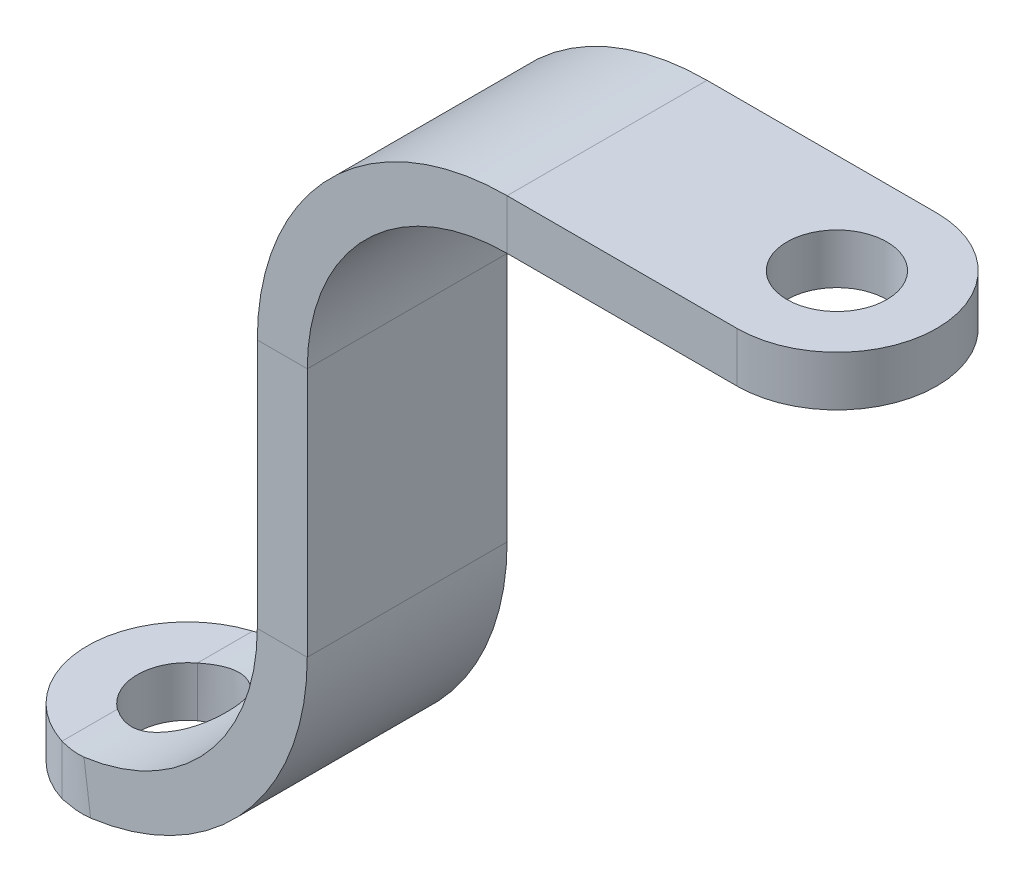
ISO-10303-21;
HEADER;
FILE_DESCRIPTION(('STEP AP214'),'2;1');
FILE_NAME('part.step','',(''),(''),'','','');
FILE_SCHEMA(('AUTOMOTIVE_DESIGN { 1 0 10303 214 1 1 1 1 }'));
ENDSEC;
DATA;
#1=APPLICATION_CONTEXT('core data for automotive mechanical design processes');
#2=APPLICATION_PROTOCOL_DEFINITION('international standard','automotive_design',2000,#1);
#3=PRODUCT_CONTEXT('',#1,'mechanical');
#4=PRODUCT('Part','Part','',(#3));
#5=PRODUCT_RELATED_PRODUCT_CATEGORY('part','',(#4));
#6=PRODUCT_DEFINITION_FORMATION('','',#4);
#7=PRODUCT_DEFINITION_CONTEXT('part definition',#1,'design');
#8=PRODUCT_DEFINITION('design','',#6,#7);
#9=PRODUCT_DEFINITION_SHAPE('','',#8);
#10=(LENGTH_UNIT() NAMED_UNIT(*) SI_UNIT(.MILLI.,.METRE.));
#11=(NAMED_UNIT(*) PLANE_ANGLE_UNIT() SI_UNIT($,.RADIAN.));
#12=(NAMED_UNIT(*) SI_UNIT($,.STERADIAN.) SOLID_ANGLE_UNIT());
#13=UNCERTAINTY_MEASURE_WITH_UNIT(LENGTH_MEASURE(1.E-05),#10,'distance_accuracy_value','');
#14=(GEOMETRIC_REPRESENTATION_CONTEXT(3) GLOBAL_UNCERTAINTY_ASSIGNED_CONTEXT((#13)) GLOBAL_UNIT_ASSIGNED_CONTEXT((#10,
#11,#12)) REPRESENTATION_CONTEXT('',''));
#15=CARTESIAN_POINT('',(0.,0.,0.));
#16=DIRECTION('',(0.,0.,1.));
#17=DIRECTION('',(1.,0.,0.));
#18=AXIS2_PLACEMENT_3D('',#15,#16,#17);
#19=CARTESIAN_POINT('',(11.,-13.3285413235574,0.));
#20=DIRECTION('',(-1.,0.,0.));
#21=DIRECTION('',(0.,0.,1.));
#22=AXIS2_PLACEMENT_3D('',#19,#20,#21);
#23=PLANE('',#22);
#24=DIRECTION('',(0.,1.,0.));
#25=VECTOR('',#24,1.);
#26=CARTESIAN_POINT('',(11.,-13.3285413235574,5.));
#27=LINE('',#26,#25);
#28=CARTESIAN_POINT('',(11.,-22.5,5.));
#29=VERTEX_POINT('',#28);
#30=CARTESIAN_POINT('',(11.,-10.,5.));
#31=VERTEX_POINT('',#30);
#32=EDGE_CURVE('E84',#29,#31,#27,.T.);
#33=ORIENTED_EDGE('',*,*,#32,.F.);
#34=DIRECTION('',(0.,0.,-1.));
#35=VECTOR('',#34,1.);
#36=CARTESIAN_POINT('',(11.,-22.5,0.));
#37=LINE('',#36,#35);
#38=CARTESIAN_POINT('',(11.,-22.5,-5.));
#39=VERTEX_POINT('',#38);
#40=EDGE_CURVE('E76',#29,#39,#37,.T.);
#41=ORIENTED_EDGE('',*,*,#40,.T.);
#42=DIRECTION('',(0.,1.,0.));
#43=VECTOR('',#42,1.);
#44=CARTESIAN_POINT('',(11.,-13.3285413235574,-5.));
#45=LINE('',#44,#43);
#46=CARTESIAN_POINT('',(11.,-10.,-5.));
#47=VERTEX_POINT('',#46);
#48=EDGE_CURVE('E92',#39,#47,#45,.T.);
#49=ORIENTED_EDGE('',*,*,#48,.T.);
#50=DIRECTION('',(0.,0.,-1.));
#51=VECTOR('',#50,1.);
#52=CARTESIAN_POINT('',(11.,-10.,0.));
#53=LINE('',#52,#51);
#54=EDGE_CURVE('E426',#31,#47,#53,.T.);
#55=ORIENTED_EDGE('',*,*,#54,.F.);
#56=EDGE_LOOP('',(#33,#41,#49,#55));
#57=FACE_BOUND('',#56,.T.);
#58=ADVANCED_FACE('F66',(#57),#23,.F.);
#59=CARTESIAN_POINT('',(8.49999999999997,-13.3285413235574,0.));
#60=DIRECTION('',(-1.,0.,0.));
#61=DIRECTION('',(0.,0.,1.));
#62=AXIS2_PLACEMENT_3D('',#59,#60,#61);
#63=PLANE('',#62);
#64=DIRECTION('',(0.,0.,-1.));
#65=VECTOR('',#64,1.);
#66=CARTESIAN_POINT('',(8.5,-22.5,0.));
#67=LINE('',#66,#65);
#68=CARTESIAN_POINT('',(8.5,-22.5,5.));
#69=VERTEX_POINT('',#68);
#70=CARTESIAN_POINT('',(8.5,-22.5,-5.));
#71=VERTEX_POINT('',#70);
#72=EDGE_CURVE('E430',#69,#71,#67,.T.);
#73=ORIENTED_EDGE('',*,*,#72,.F.);
#74=DIRECTION('',(0.,1.,0.));
#75=VECTOR('',#74,1.);
#76=CARTESIAN_POINT('',(8.49999999999997,-13.3285413235574,5.));
#77=LINE('',#76,#75);
#78=CARTESIAN_POINT('',(8.49999999999996,-10.,5.));
#79=VERTEX_POINT('',#78);
#80=EDGE_CURVE('E439',#69,#79,#77,.T.);
#81=ORIENTED_EDGE('',*,*,#80,.T.);
#82=DIRECTION('',(0.,0.,-1.));
#83=VECTOR('',#82,1.);
#84=CARTESIAN_POINT('',(8.49999999999996,-10.,0.));
#85=LINE('',#84,#83);
#86=CARTESIAN_POINT('',(8.49999999999996,-10.,-5.));
#87=VERTEX_POINT('',#86);
#88=EDGE_CURVE('E419',#79,#87,#85,.T.);
#89=ORIENTED_EDGE('',*,*,#88,.T.);
#90=DIRECTION('',(0.,1.,0.));
#91=VECTOR('',#90,1.);
#92=CARTESIAN_POINT('',(8.49999999999997,-13.3285413235574,-5.));
#93=LINE('',#92,#91);
#94=EDGE_CURVE('E423',#71,#87,#93,.T.);
#95=ORIENTED_EDGE('',*,*,#94,.F.);
#96=EDGE_LOOP('',(#73,#81,#89,#95));
#97=FACE_BOUND('',#96,.T.);
#98=ADVANCED_FACE('F593',(#97),#63,.T.);
#99=CARTESIAN_POINT('',(8.49999999999997,-13.3285413235574,5.));
#100=DIRECTION('',(0.,0.,1.));
#101=DIRECTION('',(0.,1.,0.));
#102=AXIS2_PLACEMENT_3D('',#99,#100,#101);
#103=PLANE('',#102);
#104=DIRECTION('',(-1.,0.,0.));
#105=VECTOR('',#104,1.);
#106=CARTESIAN_POINT('',(8.5,-22.5,5.));
#107=LINE('',#106,#105);
#108=EDGE_CURVE('E12',#29,#69,#107,.T.);
#109=ORIENTED_EDGE('',*,*,#108,.F.);
#110=ORIENTED_EDGE('',*,*,#32,.T.);
#111=DIRECTION('',(-1.,0.,0.));
#112=VECTOR('',#111,1.);
#113=CARTESIAN_POINT('',(8.49999999999996,-10.,5.));
#114=LINE('',#113,#112);
#115=EDGE_CURVE('E422',#31,#79,#114,.T.);
#116=ORIENTED_EDGE('',*,*,#115,.T.);
#117=ORIENTED_EDGE('',*,*,#80,.F.);
#118=EDGE_LOOP('',(#109,#110,#116,#117));
#119=FACE_BOUND('',#118,.T.);
#120=ADVANCED_FACE('F590',(#119),#103,.T.);
#121=CARTESIAN_POINT('',(8.49999999999997,-13.3285413235574,-5.));
#122=DIRECTION('',(0.,0.,1.));
#123=DIRECTION('',(0.,1.,0.));
#124=AXIS2_PLACEMENT_3D('',#121,#122,#123);
#125=PLANE('',#124);
#126=DIRECTION('',(1.,0.,0.));
#127=VECTOR('',#126,1.);
#128=CARTESIAN_POINT('',(8.5,-22.5,-5.));
#129=LINE('',#128,#127);
#130=EDGE_CURVE('E432',#71,#39,#129,.T.);
#131=ORIENTED_EDGE('',*,*,#130,.F.);
#132=ORIENTED_EDGE('',*,*,#94,.T.);
#133=DIRECTION('',(1.,0.,0.));
#134=VECTOR('',#133,1.);
#135=CARTESIAN_POINT('',(8.49999999999996,-10.,-5.));
#136=LINE('',#135,#134);
#137=EDGE_CURVE('E428',#87,#47,#136,.T.);
#138=ORIENTED_EDGE('',*,*,#137,.T.);
#139=ORIENTED_EDGE('',*,*,#48,.F.);
#140=EDGE_LOOP('',(#131,#132,#138,#139));
#141=FACE_BOUND('',#140,.T.);
#142=ADVANCED_FACE('F579',(#141),#125,.F.);
#143=CARTESIAN_POINT('',(32.5,2.5,0.));
#144=DIRECTION('',(0.,1.,0.));
#145=DIRECTION('',(0.,0.,1.));
#146=AXIS2_PLACEMENT_3D('',#143,#144,#145);
#147=CYLINDRICAL_SURFACE('',#146,2.5);
#148=CARTESIAN_POINT('',(32.5,2.5,0.));
#149=DIRECTION('',(0.,1.,0.));
#150=DIRECTION('',(0.,0.,1.));
#151=AXIS2_PLACEMENT_3D('',#148,#149,#150);
#152=CIRCLE('',#151,2.5);
#153=CARTESIAN_POINT('',(32.5,2.5,2.5));
#154=VERTEX_POINT('',#153);
#155=EDGE_CURVE('E408',#154,#154,#152,.T.);
#156=ORIENTED_EDGE('',*,*,#155,.T.);
#157=EDGE_LOOP('',(#156));
#158=FACE_BOUND('',#157,.T.);
#159=CARTESIAN_POINT('',(32.5,0.,0.));
#160=DIRECTION('',(0.,1.,0.));
#161=DIRECTION('',(0.,0.,1.));
#162=AXIS2_PLACEMENT_3D('',#159,#160,#161);
#163=CIRCLE('',#162,2.5);
#164=CARTESIAN_POINT('',(32.5,0.,2.5));
#165=VERTEX_POINT('',#164);
#166=EDGE_CURVE('E389',#165,#165,#163,.T.);
#167=ORIENTED_EDGE('',*,*,#166,.F.);
#168=EDGE_LOOP('',(#167));
#169=FACE_BOUND('',#168,.T.);
#170=ADVANCED_FACE('F616',(#158,#169),#147,.F.);
#171=CARTESIAN_POINT('',(32.5,2.5,0.));
#172=DIRECTION('',(0.,1.,0.));
#173=DIRECTION('',(0.,0.,1.));
#174=AXIS2_PLACEMENT_3D('',#171,#172,#173);
#175=CYLINDRICAL_SURFACE('',#174,5.);
#176=CARTESIAN_POINT('',(32.5,0.,0.));
#177=DIRECTION('',(0.,1.,0.));
#178=DIRECTION('',(0.,0.,1.));
#179=AXIS2_PLACEMENT_3D('',#176,#177,#178);
#180=CIRCLE('',#179,5.);
#181=CARTESIAN_POINT('',(32.5,0.,5.));
#182=VERTEX_POINT('',#181);
#183=CARTESIAN_POINT('',(32.5,0.,-5.));
#184=VERTEX_POINT('',#183);
#185=EDGE_CURVE('E405',#182,#184,#180,.T.);
#186=ORIENTED_EDGE('',*,*,#185,.T.);
#187=DIRECTION('',(0.,1.,0.));
#188=VECTOR('',#187,1.);
#189=CARTESIAN_POINT('',(32.5,2.5,-5.));
#190=LINE('',#189,#188);
#191=CARTESIAN_POINT('',(32.5,2.5,-5.));
#192=VERTEX_POINT('',#191);
#193=EDGE_CURVE('E402',#184,#192,#190,.T.);
#194=ORIENTED_EDGE('',*,*,#193,.T.);
#195=CARTESIAN_POINT('',(32.5,2.5,0.));
#196=DIRECTION('',(0.,1.,0.));
#197=DIRECTION('',(0.,0.,1.));
#198=AXIS2_PLACEMENT_3D('',#195,#196,#197);
#199=CIRCLE('',#198,5.);
#200=CARTESIAN_POINT('',(32.5,2.5,5.));
#201=VERTEX_POINT('',#200);
#202=EDGE_CURVE('E397',#201,#192,#199,.T.);
#203=ORIENTED_EDGE('',*,*,#202,.F.);
#204=DIRECTION('',(0.,1.,0.));
#205=VECTOR('',#204,1.);
#206=CARTESIAN_POINT('',(32.5,2.5,5.));
#207=LINE('',#206,#205);
#208=EDGE_CURVE('E392',#182,#201,#207,.T.);
#209=ORIENTED_EDGE('',*,*,#208,.F.);
#210=EDGE_LOOP('',(#186,#194,#203,#209));
#211=FACE_BOUND('',#210,.T.);
#212=ADVANCED_FACE('F614',(#211),#175,.T.);
#213=CARTESIAN_POINT('',(0.,2.5,0.));
#214=DIRECTION('',(0.,1.,0.));
#215=DIRECTION('',(0.,0.,1.));
#216=AXIS2_PLACEMENT_3D('',#213,#214,#215);
#217=PLANE('',#216);
#218=DIRECTION('',(0.,0.,-1.));
#219=VECTOR('',#218,1.);
#220=CARTESIAN_POINT('',(21.,2.5,0.));
#221=LINE('',#220,#219);
#222=CARTESIAN_POINT('',(21.,2.5,5.));
#223=VERTEX_POINT('',#222);
#224=CARTESIAN_POINT('',(21.,2.5,-5.));
#225=VERTEX_POINT('',#224);
#226=EDGE_CURVE('E376',#223,#225,#221,.T.);
#227=ORIENTED_EDGE('',*,*,#226,.F.);
#228=DIRECTION('',(1.,0.,0.));
#229=VECTOR('',#228,1.);
#230=CARTESIAN_POINT('',(0.,2.5,5.));
#231=LINE('',#230,#229);
#232=EDGE_CURVE('E400',#223,#201,#231,.T.);
#233=ORIENTED_EDGE('',*,*,#232,.T.);
#234=ORIENTED_EDGE('',*,*,#202,.T.);
#235=DIRECTION('',(1.,0.,0.));
#236=VECTOR('',#235,1.);
#237=CARTESIAN_POINT('',(0.,2.5,-5.));
#238=LINE('',#237,#236);
#239=EDGE_CURVE('E382',#225,#192,#238,.T.);
#240=ORIENTED_EDGE('',*,*,#239,.F.);
#241=EDGE_LOOP('',(#227,#233,#234,#240));
#242=FACE_BOUND('',#241,.T.);
#243=ORIENTED_EDGE('',*,*,#155,.F.);
#244=EDGE_LOOP('',(#243));
#245=FACE_BOUND('',#244,.T.);
#246=ADVANCED_FACE('F605',(#242,#245),#217,.T.);
#247=CARTESIAN_POINT('',(0.,2.5,5.));
#248=DIRECTION('',(0.,0.,1.));
#249=DIRECTION('',(1.,0.,0.));
#250=AXIS2_PLACEMENT_3D('',#247,#248,#249);
#251=PLANE('',#250);
#252=DIRECTION('',(0.,1.,0.));
#253=VECTOR('',#252,1.);
#254=CARTESIAN_POINT('',(21.,2.5,5.));
#255=LINE('',#254,#253);
#256=CARTESIAN_POINT('',(21.,0.,5.));
#257=VERTEX_POINT('',#256);
#258=EDGE_CURVE('E411',#257,#223,#255,.T.);
#259=ORIENTED_EDGE('',*,*,#258,.F.);
#260=DIRECTION('',(1.,0.,0.));
#261=VECTOR('',#260,1.);
#262=CARTESIAN_POINT('',(0.,0.,5.));
#263=LINE('',#262,#261);
#264=EDGE_CURVE('E395',#257,#182,#263,.T.);
#265=ORIENTED_EDGE('',*,*,#264,.T.);
#266=ORIENTED_EDGE('',*,*,#208,.T.);
#267=ORIENTED_EDGE('',*,*,#232,.F.);
#268=EDGE_LOOP('',(#259,#265,#266,#267));
#269=FACE_BOUND('',#268,.T.);
#270=ADVANCED_FACE('F600',(#269),#251,.T.);
#271=CARTESIAN_POINT('',(0.,0.,0.));
#272=DIRECTION('',(0.,1.,0.));
#273=DIRECTION('',(0.,0.,1.));
#274=AXIS2_PLACEMENT_3D('',#271,#272,#273);
#275=PLANE('',#274);
#276=ORIENTED_EDGE('',*,*,#166,.T.);
#277=EDGE_LOOP('',(#276));
#278=FACE_BOUND('',#277,.T.);
#279=ORIENTED_EDGE('',*,*,#264,.F.);
#280=DIRECTION('',(0.,0.,-1.));
#281=VECTOR('',#280,1.);
#282=CARTESIAN_POINT('',(21.,0.,0.));
#283=LINE('',#282,#281);
#284=CARTESIAN_POINT('',(21.,0.,-5.));
#285=VERTEX_POINT('',#284);
#286=EDGE_CURVE('E386',#257,#285,#283,.T.);
#287=ORIENTED_EDGE('',*,*,#286,.T.);
#288=DIRECTION('',(1.,0.,0.));
#289=VECTOR('',#288,1.);
#290=CARTESIAN_POINT('',(0.,0.,-5.));
#291=LINE('',#290,#289);
#292=EDGE_CURVE('E384',#285,#184,#291,.T.);
#293=ORIENTED_EDGE('',*,*,#292,.T.);
#294=ORIENTED_EDGE('',*,*,#185,.F.);
#295=EDGE_LOOP('',(#279,#287,#293,#294));
#296=FACE_BOUND('',#295,.T.);
#297=ADVANCED_FACE('F612',(#278,#296),#275,.F.);
#298=CARTESIAN_POINT('',(0.,2.5,-5.));
#299=DIRECTION('',(0.,0.,1.));
#300=DIRECTION('',(1.,0.,0.));
#301=AXIS2_PLACEMENT_3D('',#298,#299,#300);
#302=PLANE('',#301);
#303=DIRECTION('',(0.,-1.,0.));
#304=VECTOR('',#303,1.);
#305=CARTESIAN_POINT('',(21.,2.5,-5.));
#306=LINE('',#305,#304);
#307=EDGE_CURVE('E414',#225,#285,#306,.T.);
#308=ORIENTED_EDGE('',*,*,#307,.F.);
#309=ORIENTED_EDGE('',*,*,#239,.T.);
#310=ORIENTED_EDGE('',*,*,#193,.F.);
#311=ORIENTED_EDGE('',*,*,#292,.F.);
#312=EDGE_LOOP('',(#308,#309,#310,#311));
#313=FACE_BOUND('',#312,.T.);
#314=ADVANCED_FACE('F609',(#313),#302,.F.);
#315=CARTESIAN_POINT('',(21.,-10.,5.));
#316=DIRECTION('',(0.,0.,1.));
#317=DIRECTION('',(1.,0.,0.));
#318=AXIS2_PLACEMENT_3D('',#315,#316,#317);
#319=PLANE('',#318);
#320=ORIENTED_EDGE('',*,*,#115,.F.);
#321=CARTESIAN_POINT('',(21.,-10.,5.));
#322=DIRECTION('',(0.,0.,1.));
#323=DIRECTION('',(1.,0.,0.));
#324=AXIS2_PLACEMENT_3D('',#321,#322,#323);
#325=CIRCLE('',#324,10.);
#326=EDGE_CURVE('E377',#31,#257,#325,.F.);
#327=ORIENTED_EDGE('',*,*,#326,.T.);
#328=ORIENTED_EDGE('',*,*,#258,.T.);
#329=CARTESIAN_POINT('',(21.,-10.,5.));
#330=DIRECTION('',(0.,0.,-1.));
#331=DIRECTION('',(-1.,0.,0.));
#332=AXIS2_PLACEMENT_3D('',#329,#330,#331);
#333=CIRCLE('',#332,12.5);
#334=EDGE_CURVE('E365',#79,#223,#333,.T.);
#335=ORIENTED_EDGE('',*,*,#334,.F.);
#336=EDGE_LOOP('',(#320,#327,#328,#335));
#337=FACE_BOUND('',#336,.T.);
#338=ADVANCED_FACE('F597',(#337),#319,.T.);
#339=CARTESIAN_POINT('',(21.,-10.,-5.));
#340=DIRECTION('',(0.,0.,-1.));
#341=DIRECTION('',(-1.,0.,0.));
#342=AXIS2_PLACEMENT_3D('',#339,#340,#341);
#343=PLANE('',#342);
#344=CARTESIAN_POINT('',(21.,-10.,-5.));
#345=DIRECTION('',(0.,0.,1.));
#346=DIRECTION('',(1.,0.,0.));
#347=AXIS2_PLACEMENT_3D('',#344,#345,#346);
#348=CIRCLE('',#347,10.);
#349=EDGE_CURVE('E374',#285,#47,#348,.T.);
#350=ORIENTED_EDGE('',*,*,#349,.T.);
#351=ORIENTED_EDGE('',*,*,#137,.F.);
#352=CARTESIAN_POINT('',(21.,-10.,-5.));
#353=DIRECTION('',(0.,0.,1.));
#354=DIRECTION('',(-1.,0.,0.));
#355=AXIS2_PLACEMENT_3D('',#352,#353,#354);
#356=CIRCLE('',#355,12.5);
#357=EDGE_CURVE('E373',#225,#87,#356,.T.);
#358=ORIENTED_EDGE('',*,*,#357,.F.);
#359=ORIENTED_EDGE('',*,*,#307,.T.);
#360=EDGE_LOOP('',(#350,#351,#358,#359));
#361=FACE_BOUND('',#360,.T.);
#362=ADVANCED_FACE('F582',(#361),#343,.T.);
#363=CARTESIAN_POINT('',(21.,-10.,-20.4580168088996));
#364=DIRECTION('',(0.,0.,1.));
#365=DIRECTION('',(1.,0.,0.));
#366=AXIS2_PLACEMENT_3D('',#363,#364,#365);
#367=CYLINDRICAL_SURFACE('',#366,12.5);
#368=ORIENTED_EDGE('',*,*,#226,.T.);
#369=ORIENTED_EDGE('',*,*,#357,.T.);
#370=ORIENTED_EDGE('',*,*,#88,.F.);
#371=ORIENTED_EDGE('',*,*,#334,.T.);
#372=EDGE_LOOP('',(#368,#369,#370,#371));
#373=FACE_BOUND('',#372,.T.);
#374=ADVANCED_FACE('F596',(#373),#367,.T.);
#375=CARTESIAN_POINT('',(21.,-10.,-20.4580168088996));
#376=DIRECTION('',(0.,0.,1.));
#377=DIRECTION('',(1.,0.,0.));
#378=AXIS2_PLACEMENT_3D('',#375,#376,#377);
#379=CYLINDRICAL_SURFACE('',#378,10.);
#380=ORIENTED_EDGE('',*,*,#286,.F.);
#381=ORIENTED_EDGE('',*,*,#326,.F.);
#382=ORIENTED_EDGE('',*,*,#54,.T.);
#383=ORIENTED_EDGE('',*,*,#349,.F.);
#384=EDGE_LOOP('',(#380,#381,#382,#383));
#385=FACE_BOUND('',#384,.T.);
#386=ADVANCED_FACE('F292',(#385),#379,.F.);
#387=CARTESIAN_POINT('',(-1.5,-35.0000000000001,4.76969600708472));
#388=CARTESIAN_POINT('',(-0.791608555650124,-35.0000000000001,4.92127002139306));
#389=CARTESIAN_POINT('',(-0.236930427655414,-34.9425257444923,4.99803075998161));
#390=CARTESIAN_POINT('',(0.161732782778974,-34.8890534004273,5.));
#391=CARTESIAN_POINT('',(-1.5,-32.5000000000001,4.76969600708472));
#392=CARTESIAN_POINT('',(-0.933289020562018,-32.5000000000001,4.92126943938538));
#393=CARTESIAN_POINT('',(-0.489542755965369,-32.4540203828437,4.99803076977536));
#394=CARTESIAN_POINT('',(-0.170613773776821,-32.4112427203419,5.));
#395=B_SPLINE_SURFACE_WITH_KNOTS('',1,3,((#387,#388,#389,#390),(#391,#392,#393,#394)),
.UNSPECIFIED.,.F.,.F.,.F.,(2,2),(4,4),(0.,1.),(0.,1.),.UNSPECIFIED.);
#396=CARTESIAN_POINT('',(-1.5,-32.5000000000001,4.76969600708472));
#397=CARTESIAN_POINT('',(-1.5,-35.0000000000001,4.76969600708472));
#398=B_SPLINE_CURVE_WITH_KNOTS('',1,(#396,#397),.UNSPECIFIED.,.F.,.F.,(2,2),(0.,1.),.UNSPECIFIED.);
#399=CARTESIAN_POINT('',(-1.50000000000001,-35.0000000000001,4.76969600708472));
#400=VERTEX_POINT('',#399);
#401=CARTESIAN_POINT('',(-1.49999999999999,-32.5000000000001,4.76969600708472));
#402=VERTEX_POINT('',#401);
#403=EDGE_CURVE('E195',#400,#402,#398,.F.);
#404=CARTESIAN_POINT('',(-1.5,-35.0000000000001,4.76969600708472));
#405=CARTESIAN_POINT('',(-0.791608555650124,-35.0000000000001,4.92127002139306));
#406=CARTESIAN_POINT('',(-0.236930427655414,-34.9425257444923,4.99803075998161));
#407=CARTESIAN_POINT('',(0.161732782778974,-34.8890534004273,5.));
#408=B_SPLINE_CURVE_WITH_KNOTS('',3,(#404,#405,#406,#407),.UNSPECIFIED.,.F.,.F.,(4,4),(0.,1.),.UNSPECIFIED.);
#409=CARTESIAN_POINT('',(0.161732782778974,-34.8890534004273,5.));
#410=VERTEX_POINT('',#409);
#411=EDGE_CURVE('E504',#400,#410,#408,.T.);
#412=CARTESIAN_POINT('',(0.161732782778974,-34.8890534004273,5.));
#413=CARTESIAN_POINT('',(-0.170613773776821,-32.4112427203419,5.));
#414=B_SPLINE_CURVE_WITH_KNOTS('',1,(#412,#413),.UNSPECIFIED.,.F.,.F.,(2,2),(0.,1.),.UNSPECIFIED.);
#415=CARTESIAN_POINT('',(-0.170613773776821,-32.4112427203419,5.));
#416=VERTEX_POINT('',#415);
#417=EDGE_CURVE('E326',#410,#416,#414,.T.);
#418=CARTESIAN_POINT('',(-0.170613773776821,-32.4112427203419,5.));
#419=CARTESIAN_POINT('',(-0.489542755965369,-32.4540203828437,4.99803076977536));
#420=CARTESIAN_POINT('',(-0.933289020562018,-32.5000000000001,4.92126943938538));
#421=CARTESIAN_POINT('',(-1.5,-32.5000000000001,4.76969600708472));
#422=B_SPLINE_CURVE_WITH_KNOTS('',3,(#418,#419,#420,#421),.UNSPECIFIED.,.F.,.F.,(4,4),(0.,1.),.UNSPECIFIED.);
#423=EDGE_CURVE('E272',#402,#416,#422,.F.);
#424=ORIENTED_EDGE('',*,*,#403,.F.);
#425=ORIENTED_EDGE('',*,*,#411,.T.);
#426=ORIENTED_EDGE('',*,*,#417,.T.);
#427=ORIENTED_EDGE('',*,*,#423,.F.);
#428=EDGE_LOOP('',(#424,#425,#426,#427));
#429=FACE_BOUND('',#428,.T.);
#430=ADVANCED_FACE('F279',(#429),#395,.F.);
#431=CARTESIAN_POINT('',(-1.5,-22.5000000000001,5.));
#432=DIRECTION('',(0.,0.,-1.));
#433=DIRECTION('',(0.,1.,0.));
#434=AXIS2_PLACEMENT_3D('',#431,#432,#433);
#435=PLANE('',#434);
#436=ORIENTED_EDGE('',*,*,#417,.F.);
#437=CARTESIAN_POINT('',(-1.5,-22.5000000000001,5.));
#438=DIRECTION('',(0.,0.,1.));
#439=DIRECTION('',(0.,-1.,0.));
#440=AXIS2_PLACEMENT_3D('',#437,#438,#439);
#441=CIRCLE('',#440,12.5);
#442=EDGE_CURVE('E558',#410,#29,#441,.T.);
#443=ORIENTED_EDGE('',*,*,#442,.T.);
#444=ORIENTED_EDGE('',*,*,#108,.T.);
#445=CARTESIAN_POINT('',(-1.5,-22.5000000000001,5.));
#446=DIRECTION('',(0.,0.,1.));
#447=DIRECTION('',(0.,-1.,0.));
#448=AXIS2_PLACEMENT_3D('',#445,#446,#447);
#449=CIRCLE('',#448,10.);
#450=EDGE_CURVE('E226',#416,#69,#449,.T.);
#451=ORIENTED_EDGE('',*,*,#450,.F.);
#452=EDGE_LOOP('',(#436,#443,#444,#451));
#453=FACE_BOUND('',#452,.T.);
#454=ADVANCED_FACE('F291',(#453),#435,.F.);
#455=CARTESIAN_POINT('',(-1.5,-22.5000000000001,-5.));
#456=DIRECTION('',(0.,0.,1.));
#457=DIRECTION('',(0.,-1.,0.));
#458=AXIS2_PLACEMENT_3D('',#455,#456,#457);
#459=PLANE('',#458);
#460=ORIENTED_EDGE('',*,*,#130,.T.);
#461=CARTESIAN_POINT('',(-1.5,-22.5000000000001,-5.));
#462=DIRECTION('',(0.,0.,1.));
#463=DIRECTION('',(0.,-1.,0.));
#464=AXIS2_PLACEMENT_3D('',#461,#462,#463);
#465=CIRCLE('',#464,12.5);
#466=CARTESIAN_POINT('',(0.161732782778979,-34.8890534004273,-5.));
#467=VERTEX_POINT('',#466);
#468=EDGE_CURVE('E237',#39,#467,#465,.F.);
#469=ORIENTED_EDGE('',*,*,#468,.T.);
#470=CARTESIAN_POINT('',(-0.17061377377682,-32.4112427203419,-5.));
#471=CARTESIAN_POINT('',(0.161732782778974,-34.8890534004273,-5.));
#472=B_SPLINE_CURVE_WITH_KNOTS('',1,(#470,#471),.UNSPECIFIED.,.F.,.F.,(2,2),(0.,1.),.UNSPECIFIED.);
#473=CARTESIAN_POINT('',(-0.170613773776817,-32.4112427203419,-5.));
#474=VERTEX_POINT('',#473);
#475=EDGE_CURVE('E538',#467,#474,#472,.F.);
#476=ORIENTED_EDGE('',*,*,#475,.T.);
#477=CARTESIAN_POINT('',(-1.5,-22.5000000000001,-5.));
#478=DIRECTION('',(0.,0.,-1.));
#479=DIRECTION('',(0.,-1.,0.));
#480=AXIS2_PLACEMENT_3D('',#477,#478,#479);
#481=CIRCLE('',#480,10.);
#482=EDGE_CURVE('E217',#71,#474,#481,.T.);
#483=ORIENTED_EDGE('',*,*,#482,.F.);
#484=EDGE_LOOP('',(#460,#469,#476,#483));
#485=FACE_BOUND('',#484,.T.);
#486=ADVANCED_FACE('F576',(#485),#459,.F.);
#487=CARTESIAN_POINT('',(0.161732782778974,-34.8890534004273,-5.));
#488=CARTESIAN_POINT('',(-0.562064371728405,-34.9861356730476,-4.95226013219824));
#489=CARTESIAN_POINT('',(-1.11965236813076,-35.0000000000001,-4.87534187704125));
#490=CARTESIAN_POINT('',(-1.5,-35.0000000000001,-4.76969600708471));
#491=CARTESIAN_POINT('',(-0.17061377377682,-32.4112427203419,-5.));
#492=CARTESIAN_POINT('',(-0.749671970060925,-32.4889112844203,-4.9522584442893));
#493=CARTESIAN_POINT('',(-1.19569007754454,-32.5000000000001,-4.8753529239433));
#494=CARTESIAN_POINT('',(-1.5,-32.5000000000001,-4.76969600708471));
#495=B_SPLINE_SURFACE_WITH_KNOTS('',1,3,((#487,#488,#489,#490),(#491,#492,#493,#494)),
.UNSPECIFIED.,.F.,.F.,.F.,(2,2),(4,4),(0.,1.),(0.,1.),.UNSPECIFIED.);
#496=CARTESIAN_POINT('',(0.161732782778974,-34.8890534004273,-5.));
#497=CARTESIAN_POINT('',(-0.562064371728405,-34.9861356730476,-4.95226013219824));
#498=CARTESIAN_POINT('',(-1.11965236813076,-35.0000000000001,-4.87534187704125));
#499=CARTESIAN_POINT('',(-1.5,-35.0000000000001,-4.76969600708471));
#500=B_SPLINE_CURVE_WITH_KNOTS('',3,(#496,#497,#498,#499),.UNSPECIFIED.,.F.,.F.,(4,4),(0.,1.),.UNSPECIFIED.);
#501=CARTESIAN_POINT('',(-1.50000000000001,-35.0000000000001,-4.76969600708471));
#502=VERTEX_POINT('',#501);
#503=EDGE_CURVE('E207',#467,#502,#500,.T.);
#504=CARTESIAN_POINT('',(-1.5,-35.0000000000001,-4.76969600708471));
#505=CARTESIAN_POINT('',(-1.5,-32.5000000000001,-4.76969600708471));
#506=B_SPLINE_CURVE_WITH_KNOTS('',1,(#504,#505),.UNSPECIFIED.,.F.,.F.,(2,2),(0.,1.),.UNSPECIFIED.);
#507=CARTESIAN_POINT('',(-1.5,-32.5000000000001,-4.76969600708471));
#508=VERTEX_POINT('',#507);
#509=EDGE_CURVE('E185',#508,#502,#506,.F.);
#510=CARTESIAN_POINT('',(-1.5,-32.5000000000001,-4.76969600708471));
#511=CARTESIAN_POINT('',(-1.19569007754454,-32.5000000000001,-4.8753529239433));
#512=CARTESIAN_POINT('',(-0.749671970060925,-32.4889112844203,-4.9522584442893));
#513=CARTESIAN_POINT('',(-0.17061377377682,-32.4112427203419,-5.));
#514=B_SPLINE_CURVE_WITH_KNOTS('',3,(#510,#511,#512,#513),.UNSPECIFIED.,.F.,.F.,(4,4),(0.,1.),.UNSPECIFIED.);
#515=EDGE_CURVE('E204',#474,#508,#514,.F.);
#516=ORIENTED_EDGE('',*,*,#475,.F.);
#517=ORIENTED_EDGE('',*,*,#503,.T.);
#518=ORIENTED_EDGE('',*,*,#509,.F.);
#519=ORIENTED_EDGE('',*,*,#515,.F.);
#520=EDGE_LOOP('',(#516,#517,#518,#519));
#521=FACE_BOUND('',#520,.T.);
#522=ADVANCED_FACE('F203',(#521),#495,.F.);
#523=CARTESIAN_POINT('',(-1.5,-35.0000000000001,-1.99999999999997));
#524=CARTESIAN_POINT('',(-1.01799047256332,-35.0000000000001,-2.32074881799592));
#525=CARTESIAN_POINT('',(-0.52624884135222,-34.9720929316399,-2.49689823601877));
#526=CARTESIAN_POINT('',(0.220460018462927,-34.8835714024057,-2.54417215733005));
#527=CARTESIAN_POINT('',(0.470871013304418,-34.8462920897144,-2.52377460268906));
#528=CARTESIAN_POINT('',(0.847960009149691,-34.7781675760002,-2.43894497811043));
#529=CARTESIAN_POINT('',(0.973900980513104,-34.7534255705147,-2.40162955448137));
#530=CARTESIAN_POINT('',(1.16307371128582,-34.713197553329,-2.33209809588348));
#531=CARTESIAN_POINT('',(1.22617478534712,-34.699269076897,-2.3066612224918));
#532=CARTESIAN_POINT('',(1.32087799603206,-34.6775899123843,-2.26511633161572));
#533=CARTESIAN_POINT('',(1.35245432984042,-34.6702324512996,-2.2507031045256));
#534=CARTESIAN_POINT('',(1.39982999302842,-34.6589987012565,-2.22823586869327));
#535=CARTESIAN_POINT('',(1.41562374098214,-34.6552211916395,-2.22060555754964));
#536=CARTESIAN_POINT('',(1.44721466626606,-34.6476001633082,-2.20506247019666));
#537=CARTESIAN_POINT('',(1.46427355026611,-34.6434470546162,-2.19650649124688));
#538=CARTESIAN_POINT('',(1.94399583927947,-34.5257356909687,-1.95194989318846));
#539=CARTESIAN_POINT('',(2.28628068874639,-34.415175763667,-1.65096516141786));
#540=CARTESIAN_POINT('',(2.73982432335465,-34.2614295321675,-0.921317818448786));
#541=CARTESIAN_POINT('',(2.85146470323096,-34.2181378616536,-0.493427885590112));
#542=CARTESIAN_POINT('',(2.85129509164076,-34.2182008445686,0.493120572914341));
#543=CARTESIAN_POINT('',(2.73962982701223,-34.2614969843837,0.922160548933273));
#544=CARTESIAN_POINT('',(2.39965700507616,-34.3767416970608,1.46936913311172));
#545=CARTESIAN_POINT('',(2.25747681662683,-34.4232367908348,1.63571343119621));
#546=CARTESIAN_POINT('',(1.99959209834361,-34.5004544515891,1.86114203336046));
#547=CARTESIAN_POINT('',(1.90619166567306,-34.5274193856088,1.93227025992147));
#548=CARTESIAN_POINT('',(1.7547545324235,-34.5689399956593,2.03294063852235));
#549=CARTESIAN_POINT('',(1.70238608041013,-34.5829577648909,2.06549377118254));
#550=CARTESIAN_POINT('',(1.62097769395641,-34.6041432771123,2.11281797986267));
#551=CARTESIAN_POINT('',(1.59336562180271,-34.6112315082942,2.12834180103768));
#552=CARTESIAN_POINT('',(1.5371861163454,-34.6254418481278,2.15888761328433));
#553=CARTESIAN_POINT('',(1.50728419538282,-34.6328914939415,2.17458822678241));
#554=CARTESIAN_POINT('',(0.592777962262989,-34.8573483243263,2.63963919536783));
#555=CARTESIAN_POINT('',(-0.406677927246047,-35.0000000000001,2.57713970412686));
#556=CARTESIAN_POINT('',(-1.5,-35.0000000000001,1.99999999999997));
#557=CARTESIAN_POINT('',(-1.5,-32.5000000000001,-1.99999999999997));
#558=CARTESIAN_POINT('',(-1.11439036800261,-32.5000000000001,-2.32075048995596));
#559=CARTESIAN_POINT('',(-0.720999073081776,-32.477674345312,-2.49689823601877));
#560=CARTESIAN_POINT('',(-0.123631985229658,-32.4068571219246,-2.54417215733005));
#561=CARTESIAN_POINT('',(0.0766968106435342,-32.3770336717715,-2.52377460268906));
#562=CARTESIAN_POINT('',(0.378368007319753,-32.3225340608002,-2.43894497811043));
#563=CARTESIAN_POINT('',(0.479120784410483,-32.3027404564118,-2.40162955448137));
#564=CARTESIAN_POINT('',(0.630458969028655,-32.2705580426632,-2.33209809588348));
#565=CARTESIAN_POINT('',(0.680939828277696,-32.2594152615176,-2.30666122249181));
#566=CARTESIAN_POINT('',(0.75670239682565,-32.2420719299074,-2.26511633161572));
#567=CARTESIAN_POINT('',(0.781963463872332,-32.2361859610397,-2.2507031045256));
#568=CARTESIAN_POINT('',(0.819863994422737,-32.2271989610052,-2.22823586869327));
#569=CARTESIAN_POINT('',(0.832498992785713,-32.2241769533116,-2.22060555754964));
#570=CARTESIAN_POINT('',(0.857771733012845,-32.2180801306466,-2.20506247019666));
#571=CARTESIAN_POINT('',(0.87141884021289,-32.214757643693,-2.19650649124688));
#572=CARTESIAN_POINT('',(1.25519667142358,-32.1205885527749,-1.95194989318846));
#573=CARTESIAN_POINT('',(1.52902455099711,-32.0321406109336,-1.65096516141786));
#574=CARTESIAN_POINT('',(1.89185945868372,-31.909143625734,-0.921317818448787));
#575=CARTESIAN_POINT('',(1.98117176258477,-31.8745102893229,-0.493427885590113));
#576=CARTESIAN_POINT('',(1.98103607331261,-31.8745606756549,0.493120572914341));
#577=CARTESIAN_POINT('',(1.89170386160979,-31.909197587507,0.922160548933272));
#578=CARTESIAN_POINT('',(1.61972560406093,-32.0013933576486,1.46936913311172));
#579=CARTESIAN_POINT('',(1.50598145330146,-32.0385894326679,1.63571343119621));
#580=CARTESIAN_POINT('',(1.29967367867489,-32.1003635612713,1.86114203336046));
#581=CARTESIAN_POINT('',(1.22495333253845,-32.121935508487,1.93227025992146));
#582=CARTESIAN_POINT('',(1.1038036259388,-32.1551519965274,2.03294063852235));
#583=CARTESIAN_POINT('',(1.06190886432811,-32.1663662119127,2.06549377118253));
#584=CARTESIAN_POINT('',(0.996782155165129,-32.1833146216899,2.11281797986266));
#585=CARTESIAN_POINT('',(0.974692497442164,-32.1889852066354,2.12834180103768));
#586=CARTESIAN_POINT('',(0.929748893076322,-32.2003534785022,2.15888761328433));
#587=CARTESIAN_POINT('',(0.905827356306256,-32.2063131951532,2.17458822678241));
#588=CARTESIAN_POINT('',(0.174222369810391,-32.3858786594611,2.63963919536783));
#589=CARTESIAN_POINT('',(-0.625407556478624,-32.5000000000001,2.57709667245407));
#590=CARTESIAN_POINT('',(-1.5,-32.5000000000001,1.99999999999997));
#591=B_SPLINE_SURFACE_WITH_KNOTS('',1,3,((#523,#524,#525,#526,#527,#528,#529,#530,#531,#532,
#533,#534,#535,#536,#537,#538,#539,#540,#541,#542,#543,#544,#545,#546,#547,#548,#549,#550,#551,
#552,#553,#554,#555,#556),(#557,#558,#559,#560,#561,#562,#563,#564,#565,#566,#567,#568,#569,
#570,#571,#572,#573,#574,#575,#576,#577,#578,#579,#580,#581,#582,#583,#584,#585,#586,#587,#588,
#589,#590)),.UNSPECIFIED.,.F.,.F.,.F.,(2,2),(4,2,2,2,2,2,2,2,2,2,2,2,2,2,2,2,4),(0.,1.),(0.,
0.125,0.1875,0.21875,0.234375,0.2421875,0.24609375,0.25,0.375,0.5,0.625,0.6875,0.71875,0.734375,
0.7421875,0.75,1.),.UNSPECIFIED.);
#592=CARTESIAN_POINT('',(-1.5,-35.0000000000001,-1.99999999999997));
#593=CARTESIAN_POINT('',(-1.01799047256332,-35.0000000000001,-2.32074881799592));
#594=CARTESIAN_POINT('',(-0.52624884135222,-34.9720929316399,-2.49689823601877));
#595=CARTESIAN_POINT('',(0.220460018462927,-34.8835714024057,-2.54417215733005));
#596=CARTESIAN_POINT('',(0.470871013304418,-34.8462920897144,-2.52377460268906));
#597=CARTESIAN_POINT('',(0.847960009149691,-34.7781675760002,-2.43894497811043));
#598=CARTESIAN_POINT('',(0.973900980513104,-34.7534255705147,-2.40162955448137));
#599=CARTESIAN_POINT('',(1.16307371128582,-34.713197553329,-2.33209809588348));
#600=CARTESIAN_POINT('',(1.22617478534712,-34.699269076897,-2.3066612224918));
#601=CARTESIAN_POINT('',(1.32087799603206,-34.6775899123843,-2.26511633161572));
#602=CARTESIAN_POINT('',(1.35245432984042,-34.6702324512996,-2.2507031045256));
#603=CARTESIAN_POINT('',(1.39982999302842,-34.6589987012565,-2.22823586869327));
#604=CARTESIAN_POINT('',(1.41562374098214,-34.6552211916395,-2.22060555754964));
#605=CARTESIAN_POINT('',(1.44721466626606,-34.6476001633082,-2.20506247019666));
#606=CARTESIAN_POINT('',(1.46427355026611,-34.6434470546162,-2.19650649124688));
#607=CARTESIAN_POINT('',(1.94399583927947,-34.5257356909687,-1.95194989318846));
#608=CARTESIAN_POINT('',(2.28628068874639,-34.415175763667,-1.65096516141786));
#609=CARTESIAN_POINT('',(2.73982432335465,-34.2614295321675,-0.921317818448786));
#610=CARTESIAN_POINT('',(2.85146470323096,-34.2181378616536,-0.493427885590112));
#611=CARTESIAN_POINT('',(2.85129509164076,-34.2182008445686,0.493120572914341));
#612=CARTESIAN_POINT('',(2.73962982701223,-34.2614969843837,0.922160548933273));
#613=CARTESIAN_POINT('',(2.39965700507616,-34.3767416970608,1.46936913311172));
#614=CARTESIAN_POINT('',(2.25747681662683,-34.4232367908348,1.63571343119621));
#615=CARTESIAN_POINT('',(1.99959209834361,-34.5004544515891,1.86114203336046));
#616=CARTESIAN_POINT('',(1.90619166567306,-34.5274193856088,1.93227025992147));
#617=CARTESIAN_POINT('',(1.7547545324235,-34.5689399956593,2.03294063852235));
#618=CARTESIAN_POINT('',(1.70238608041013,-34.5829577648909,2.06549377118254));
#619=CARTESIAN_POINT('',(1.62097769395641,-34.6041432771123,2.11281797986267));
#620=CARTESIAN_POINT('',(1.59336562180271,-34.6112315082942,2.12834180103768));
#621=CARTESIAN_POINT('',(1.5371861163454,-34.6254418481278,2.15888761328433));
#622=CARTESIAN_POINT('',(1.50728419538282,-34.6328914939415,2.17458822678241));
#623=CARTESIAN_POINT('',(0.592777962262989,-34.8573483243263,2.63963919536783));
#624=CARTESIAN_POINT('',(-0.406677927246047,-35.0000000000001,2.57713970412686));
#625=CARTESIAN_POINT('',(-1.5,-35.0000000000001,1.99999999999997));
#626=B_SPLINE_CURVE_WITH_KNOTS('',3,(#592,#593,#594,#595,#596,#597,#598,#599,#600,#601,#602,
#603,#604,#605,#606,#607,#608,#609,#610,#611,#612,#613,#614,#615,#616,#617,#618,#619,#620,#621,
#622,#623,#624,#625),.UNSPECIFIED.,.F.,.F.,(4,2,2,2,2,2,2,2,2,2,2,2,2,2,2,2,4),(0.,0.125,0.1875,
0.21875,0.234375,0.2421875,0.24609375,0.25,0.375,0.5,0.625,0.6875,0.71875,0.734375,0.7421875,
0.75,1.),.UNSPECIFIED.);
#627=CARTESIAN_POINT('',(-1.50000000000001,-35.0000000000001,-1.99999999999997));
#628=VERTEX_POINT('',#627);
#629=CARTESIAN_POINT('',(-1.50000000000001,-35.0000000000001,1.99999999999997));
#630=VERTEX_POINT('',#629);
#631=EDGE_CURVE('E502',#628,#630,#626,.T.);
#632=CARTESIAN_POINT('',(-1.5,-35.0000000000001,1.99999999999997));
#633=CARTESIAN_POINT('',(-1.5,-32.5000000000001,1.99999999999997));
#634=B_SPLINE_CURVE_WITH_KNOTS('',1,(#632,#633),.UNSPECIFIED.,.F.,.F.,(2,2),(0.,1.),.UNSPECIFIED.);
#635=CARTESIAN_POINT('',(-1.5,-32.5000000000001,1.99999999999997));
#636=VERTEX_POINT('',#635);
#637=EDGE_CURVE('E349',#636,#630,#634,.F.);
#638=CARTESIAN_POINT('',(-1.5,-32.5000000000001,1.99999999999997));
#639=CARTESIAN_POINT('',(-0.625407556478624,-32.5000000000001,2.57709667245407));
#640=CARTESIAN_POINT('',(0.174222369810391,-32.3858786594611,2.63963919536783));
#641=CARTESIAN_POINT('',(0.905827356306256,-32.2063131951532,2.17458822678241));
#642=CARTESIAN_POINT('',(0.929748893076322,-32.2003534785022,2.15888761328433));
#643=CARTESIAN_POINT('',(0.974692497442164,-32.1889852066354,2.12834180103768));
#644=CARTESIAN_POINT('',(0.996782155165129,-32.1833146216899,2.11281797986266));
#645=CARTESIAN_POINT('',(1.06190886432811,-32.1663662119127,2.06549377118253));
#646=CARTESIAN_POINT('',(1.1038036259388,-32.1551519965274,2.03294063852235));
#647=CARTESIAN_POINT('',(1.22495333253845,-32.121935508487,1.93227025992146));
#648=CARTESIAN_POINT('',(1.29967367867489,-32.1003635612713,1.86114203336046));
#649=CARTESIAN_POINT('',(1.50598145330146,-32.0385894326679,1.63571343119621));
#650=CARTESIAN_POINT('',(1.61972560406093,-32.0013933576486,1.46936913311172));
#651=CARTESIAN_POINT('',(1.89170386160979,-31.909197587507,0.922160548933272));
#652=CARTESIAN_POINT('',(1.98103607331261,-31.8745606756549,0.493120572914341));
#653=CARTESIAN_POINT('',(1.98117176258477,-31.8745102893229,-0.493427885590113));
#654=CARTESIAN_POINT('',(1.89185945868372,-31.909143625734,-0.921317818448787));
#655=CARTESIAN_POINT('',(1.52902455099711,-32.0321406109336,-1.65096516141786));
#656=CARTESIAN_POINT('',(1.25519667142358,-32.1205885527749,-1.95194989318846));
#657=CARTESIAN_POINT('',(0.87141884021289,-32.214757643693,-2.19650649124688));
#658=CARTESIAN_POINT('',(0.857771733012845,-32.2180801306466,-2.20506247019666));
#659=CARTESIAN_POINT('',(0.832498992785713,-32.2241769533116,-2.22060555754964));
#660=CARTESIAN_POINT('',(0.819863994422737,-32.2271989610052,-2.22823586869327));
#661=CARTESIAN_POINT('',(0.781963463872332,-32.2361859610397,-2.2507031045256));
#662=CARTESIAN_POINT('',(0.75670239682565,-32.2420719299074,-2.26511633161572));
#663=CARTESIAN_POINT('',(0.680939828277696,-32.2594152615176,-2.30666122249181));
#664=CARTESIAN_POINT('',(0.630458969028655,-32.2705580426632,-2.33209809588348));
#665=CARTESIAN_POINT('',(0.479120784410483,-32.3027404564118,-2.40162955448137));
#666=CARTESIAN_POINT('',(0.378368007319753,-32.3225340608002,-2.43894497811043));
#667=CARTESIAN_POINT('',(0.0766968106435342,-32.3770336717715,-2.52377460268906));
#668=CARTESIAN_POINT('',(-0.123631985229658,-32.4068571219246,-2.54417215733005));
#669=CARTESIAN_POINT('',(-0.720999073081776,-32.477674345312,-2.49689823601877));
#670=CARTESIAN_POINT('',(-1.11439036800261,-32.5000000000001,-2.32075048995596));
#671=CARTESIAN_POINT('',(-1.5,-32.5000000000001,-1.99999999999997));
#672=B_SPLINE_CURVE_WITH_KNOTS('',3,(#638,#639,#640,#641,#642,#643,#644,#645,#646,#647,#648,
#649,#650,#651,#652,#653,#654,#655,#656,#657,#658,#659,#660,#661,#662,#663,#664,#665,#666,#667,
#668,#669,#670,#671),.UNSPECIFIED.,.F.,.F.,(4,2,2,2,2,2,2,2,2,2,2,2,2,2,2,2,4),(0.,0.25,
0.2578125,0.265625,0.28125,0.3125,0.375,0.5,0.625,0.75,0.75390625,0.7578125,0.765625,0.78125,
0.8125,0.875,1.),.UNSPECIFIED.);
#673=CARTESIAN_POINT('',(-1.49999999999999,-32.5000000000001,-1.99999999999997));
#674=VERTEX_POINT('',#673);
#675=EDGE_CURVE('E219',#674,#636,#672,.F.);
#676=CARTESIAN_POINT('',(-1.5,-32.5000000000001,-1.99999999999997));
#677=CARTESIAN_POINT('',(-1.5,-35.0000000000001,-1.99999999999997));
#678=B_SPLINE_CURVE_WITH_KNOTS('',1,(#676,#677),.UNSPECIFIED.,.F.,.F.,(2,2),(0.,1.),.UNSPECIFIED.);
#679=EDGE_CURVE('E360',#628,#674,#678,.F.);
#680=ORIENTED_EDGE('',*,*,#631,.T.);
#681=ORIENTED_EDGE('',*,*,#637,.F.);
#682=ORIENTED_EDGE('',*,*,#675,.F.);
#683=ORIENTED_EDGE('',*,*,#679,.F.);
#684=EDGE_LOOP('',(#680,#681,#682,#683));
#685=FACE_BOUND('',#684,.T.);
#686=ADVANCED_FACE('F294',(#685),#591,.F.);
#687=CARTESIAN_POINT('',(-1.5,-22.5000000000001,-20.4580168088996));
#688=DIRECTION('',(0.,0.,1.));
#689=DIRECTION('',(0.,-1.,0.));
#690=AXIS2_PLACEMENT_3D('',#687,#688,#689);
#691=CYLINDRICAL_SURFACE('',#690,10.);
#692=DIRECTION('',(0.,0.,-1.));
#693=VECTOR('',#692,1.);
#694=CARTESIAN_POINT('',(-1.5,-32.5000000000001,0.));
#695=LINE('',#694,#693);
#696=EDGE_CURVE('E174',#674,#508,#695,.T.);
#697=ORIENTED_EDGE('',*,*,#696,.F.);
#698=ORIENTED_EDGE('',*,*,#675,.T.);
#699=DIRECTION('',(0.,0.,-1.));
#700=VECTOR('',#699,1.);
#701=CARTESIAN_POINT('',(-1.5,-32.5000000000001,0.));
#702=LINE('',#701,#700);
#703=EDGE_CURVE('E186',#402,#636,#702,.T.);
#704=ORIENTED_EDGE('',*,*,#703,.F.);
#705=ORIENTED_EDGE('',*,*,#423,.T.);
#706=ORIENTED_EDGE('',*,*,#450,.T.);
#707=ORIENTED_EDGE('',*,*,#72,.T.);
#708=ORIENTED_EDGE('',*,*,#482,.T.);
#709=ORIENTED_EDGE('',*,*,#515,.T.);
#710=EDGE_LOOP('',(#697,#698,#704,#705,#706,#707,#708,#709));
#711=FACE_BOUND('',#710,.T.);
#712=ADVANCED_FACE('F214',(#711),#691,.F.);
#713=CARTESIAN_POINT('',(-1.5,-22.5000000000001,-20.4580168088996));
#714=DIRECTION('',(0.,0.,1.));
#715=DIRECTION('',(0.,-1.,0.));
#716=AXIS2_PLACEMENT_3D('',#713,#714,#715);
#717=CYLINDRICAL_SURFACE('',#716,12.5);
#718=DIRECTION('',(0.,0.,-1.));
#719=VECTOR('',#718,1.);
#720=CARTESIAN_POINT('',(-1.50000000000001,-35.0000000000001,0.));
#721=LINE('',#720,#719);
#722=EDGE_CURVE('E197',#628,#502,#721,.T.);
#723=ORIENTED_EDGE('',*,*,#722,.T.);
#724=ORIENTED_EDGE('',*,*,#503,.F.);
#725=ORIENTED_EDGE('',*,*,#468,.F.);
#726=ORIENTED_EDGE('',*,*,#40,.F.);
#727=ORIENTED_EDGE('',*,*,#442,.F.);
#728=ORIENTED_EDGE('',*,*,#411,.F.);
#729=DIRECTION('',(0.,0.,-1.));
#730=VECTOR('',#729,1.);
#731=CARTESIAN_POINT('',(-1.50000000000001,-35.0000000000001,0.));
#732=LINE('',#731,#730);
#733=EDGE_CURVE('E457',#400,#630,#732,.T.);
#734=ORIENTED_EDGE('',*,*,#733,.T.);
#735=ORIENTED_EDGE('',*,*,#631,.F.);
#736=EDGE_LOOP('',(#723,#724,#725,#726,#727,#728,#734,#735));
#737=FACE_BOUND('',#736,.T.);
#738=ADVANCED_FACE('F239',(#737),#717,.T.);
#739=CARTESIAN_POINT('',(25.3429173528853,-32.5000000000001,0.));
#740=DIRECTION('',(0.,1.,0.));
#741=DIRECTION('',(0.,0.,1.));
#742=AXIS2_PLACEMENT_3D('',#739,#740,#741);
#743=PLANE('',#742);
#744=CARTESIAN_POINT('',(0.,-32.5000000000001,0.));
#745=DIRECTION('',(0.,1.,0.));
#746=DIRECTION('',(0.,0.,1.));
#747=AXIS2_PLACEMENT_3D('',#744,#745,#746);
#748=CIRCLE('',#747,5.);
#749=EDGE_CURVE('E177',#508,#402,#748,.T.);
#750=ORIENTED_EDGE('',*,*,#749,.T.);
#751=ORIENTED_EDGE('',*,*,#703,.T.);
#752=CARTESIAN_POINT('',(0.,-32.5000000000001,0.));
#753=DIRECTION('',(0.,1.,0.));
#754=DIRECTION('',(0.,0.,1.));
#755=AXIS2_PLACEMENT_3D('',#752,#753,#754);
#756=CIRCLE('',#755,2.5);
#757=EDGE_CURVE('E180',#674,#636,#756,.T.);
#758=ORIENTED_EDGE('',*,*,#757,.F.);
#759=ORIENTED_EDGE('',*,*,#696,.T.);
#760=EDGE_LOOP('',(#750,#751,#758,#759));
#761=FACE_BOUND('',#760,.T.);
#762=ADVANCED_FACE('F176',(#761),#743,.T.);
#763=CARTESIAN_POINT('',(0.,-32.5000000000001,0.));
#764=DIRECTION('',(0.,1.,0.));
#765=DIRECTION('',(0.,0.,1.));
#766=AXIS2_PLACEMENT_3D('',#763,#764,#765);
#767=CYLINDRICAL_SURFACE('',#766,5.);
#768=ORIENTED_EDGE('',*,*,#749,.F.);
#769=ORIENTED_EDGE('',*,*,#509,.T.);
#770=CARTESIAN_POINT('',(0.,-35.0000000000001,0.));
#771=DIRECTION('',(0.,1.,0.));
#772=DIRECTION('',(0.,0.,1.));
#773=AXIS2_PLACEMENT_3D('',#770,#771,#772);
#774=CIRCLE('',#773,5.);
#775=EDGE_CURVE('E209',#502,#400,#774,.T.);
#776=ORIENTED_EDGE('',*,*,#775,.T.);
#777=ORIENTED_EDGE('',*,*,#403,.T.);
#778=EDGE_LOOP('',(#768,#769,#776,#777));
#779=FACE_BOUND('',#778,.T.);
#780=ADVANCED_FACE('F191',(#779),#767,.T.);
#781=CARTESIAN_POINT('',(25.3429173528853,-35.0000000000001,0.));
#782=DIRECTION('',(0.,1.,0.));
#783=DIRECTION('',(0.,0.,1.));
#784=AXIS2_PLACEMENT_3D('',#781,#782,#783);
#785=PLANE('',#784);
#786=ORIENTED_EDGE('',*,*,#733,.F.);
#787=ORIENTED_EDGE('',*,*,#775,.F.);
#788=ORIENTED_EDGE('',*,*,#722,.F.);
#789=CARTESIAN_POINT('',(0.,-35.0000000000001,0.));
#790=DIRECTION('',(0.,1.,0.));
#791=DIRECTION('',(0.,0.,1.));
#792=AXIS2_PLACEMENT_3D('',#789,#790,#791);
#793=CIRCLE('',#792,2.5);
#794=EDGE_CURVE('E492',#628,#630,#793,.T.);
#795=ORIENTED_EDGE('',*,*,#794,.T.);
#796=EDGE_LOOP('',(#786,#787,#788,#795));
#797=FACE_BOUND('',#796,.T.);
#798=ADVANCED_FACE('F468',(#797),#785,.F.);
#799=CARTESIAN_POINT('',(0.,-32.5000000000001,0.));
#800=DIRECTION('',(0.,1.,0.));
#801=DIRECTION('',(0.,0.,1.));
#802=AXIS2_PLACEMENT_3D('',#799,#800,#801);
#803=CYLINDRICAL_SURFACE('',#802,2.5);
#804=ORIENTED_EDGE('',*,*,#794,.F.);
#805=ORIENTED_EDGE('',*,*,#679,.T.);
#806=ORIENTED_EDGE('',*,*,#757,.T.);
#807=ORIENTED_EDGE('',*,*,#637,.T.);
#808=EDGE_LOOP('',(#804,#805,#806,#807));
#809=FACE_BOUND('',#808,.T.);
#810=ADVANCED_FACE('F459',(#809),#803,.F.);
#811=CLOSED_SHELL('',(#58,#98,#120,#142,#170,#212,#246,#270,#297,#314,#338,#362,#374,#386,#430,
#454,#486,#522,#686,#712,#738,#762,#780,#798,#810));
#812=MANIFOLD_SOLID_BREP('B2',#811);
#813=ADVANCED_BREP_SHAPE_REPRESENTATION('',(#18,#812),#14);
#814=SHAPE_DEFINITION_REPRESENTATION(#9,#813);
ENDSEC;
END-ISO-10303-21;
